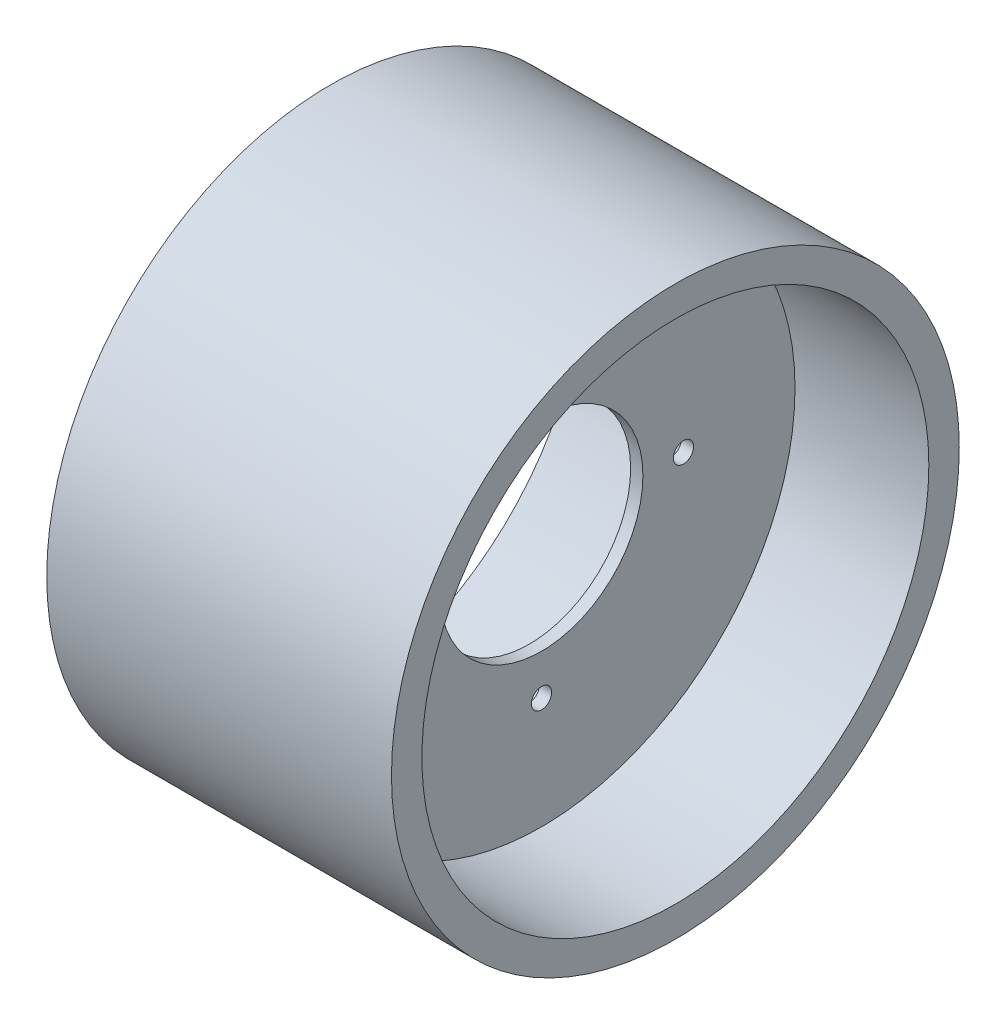
ISO-10303-21;
HEADER;
FILE_DESCRIPTION(('STEP AP214'),'2;1');
FILE_NAME('part.step','',(''),(''),'','','');
FILE_SCHEMA(('AUTOMOTIVE_DESIGN { 1 0 10303 214 1 1 1 1 }'));
ENDSEC;
DATA;
#1=APPLICATION_CONTEXT('core data for automotive mechanical design processes');
#2=APPLICATION_PROTOCOL_DEFINITION('international standard','automotive_design',2000,#1);
#3=PRODUCT_CONTEXT('',#1,'mechanical');
#4=PRODUCT('Part','Part','',(#3));
#5=PRODUCT_RELATED_PRODUCT_CATEGORY('part','',(#4));
#6=PRODUCT_DEFINITION_FORMATION('','',#4);
#7=PRODUCT_DEFINITION_CONTEXT('part definition',#1,'design');
#8=PRODUCT_DEFINITION('design','',#6,#7);
#9=PRODUCT_DEFINITION_SHAPE('','',#8);
#10=(LENGTH_UNIT() NAMED_UNIT(*) SI_UNIT(.MILLI.,.METRE.));
#11=(NAMED_UNIT(*) PLANE_ANGLE_UNIT() SI_UNIT($,.RADIAN.));
#12=(NAMED_UNIT(*) SI_UNIT($,.STERADIAN.) SOLID_ANGLE_UNIT());
#13=UNCERTAINTY_MEASURE_WITH_UNIT(LENGTH_MEASURE(1.E-05),#10,'distance_accuracy_value','');
#14=(GEOMETRIC_REPRESENTATION_CONTEXT(3) GLOBAL_UNCERTAINTY_ASSIGNED_CONTEXT((#13)) GLOBAL_UNIT_ASSIGNED_CONTEXT((#10,
#11,#12)) REPRESENTATION_CONTEXT('',''));
#15=CARTESIAN_POINT('',(0.,0.,0.));
#16=DIRECTION('',(0.,0.,1.));
#17=DIRECTION('',(1.,0.,0.));
#18=AXIS2_PLACEMENT_3D('',#15,#16,#17);
#19=CARTESIAN_POINT('',(-20.4989746825868,-313.45,0.));
#20=DIRECTION('',(-1.,0.,0.));
#21=DIRECTION('',(0.,0.,1.));
#22=AXIS2_PLACEMENT_3D('',#19,#20,#21);
#23=PLANE('',#22);
#24=CARTESIAN_POINT('',(-20.4989746825868,34.8277777777777,0.));
#25=DIRECTION('',(1.,0.,0.));
#26=DIRECTION('',(0.,0.,-1.));
#27=AXIS2_PLACEMENT_3D('',#24,#25,#26);
#28=CIRCLE('',#27,106.370826171699);
#29=CARTESIAN_POINT('',(-20.4989746825868,34.8277777777777,-106.370826171699));
#30=VERTEX_POINT('',#29);
#31=EDGE_CURVE('E10',#30,#30,#28,.T.);
#32=ORIENTED_EDGE('',*,*,#31,.T.);
#33=EDGE_LOOP('',(#32));
#34=FACE_BOUND('',#33,.T.);
#35=CARTESIAN_POINT('',(-20.4989746825868,34.8277777777777,0.));
#36=DIRECTION('',(1.,0.,0.));
#37=DIRECTION('',(0.,0.,-1.));
#38=AXIS2_PLACEMENT_3D('',#35,#36,#37);
#39=CIRCLE('',#38,125.);
#40=CARTESIAN_POINT('',(-20.4989746825868,34.8277777777777,-125.));
#41=VERTEX_POINT('',#40);
#42=EDGE_CURVE('E92',#41,#41,#39,.T.);
#43=ORIENTED_EDGE('',*,*,#42,.F.);
#44=EDGE_LOOP('',(#43));
#45=FACE_BOUND('',#44,.T.);
#46=ADVANCED_FACE('F45',(#34,#45),#23,.T.);
#47=CARTESIAN_POINT('',(60.3370717670074,34.8277777777777,0.));
#48=DIRECTION('',(1.,0.,0.));
#49=DIRECTION('',(0.,0.,-1.));
#50=AXIS2_PLACEMENT_3D('',#47,#48,#49);
#51=CYLINDRICAL_SURFACE('',#50,106.370826171699);
#52=CARTESIAN_POINT('',(-11.7127321786208,34.8277777777777,0.));
#53=DIRECTION('',(1.,0.,0.));
#54=DIRECTION('',(0.,0.,-1.));
#55=AXIS2_PLACEMENT_3D('',#52,#53,#54);
#56=CIRCLE('',#55,106.370826171699);
#57=CARTESIAN_POINT('',(-11.7127321786208,34.8277777777777,-106.370826171699));
#58=VERTEX_POINT('',#57);
#59=EDGE_CURVE('E53',#58,#58,#56,.T.);
#60=ORIENTED_EDGE('',*,*,#59,.T.);
#61=EDGE_LOOP('',(#60));
#62=FACE_BOUND('',#61,.T.);
#63=ORIENTED_EDGE('',*,*,#31,.F.);
#64=EDGE_LOOP('',(#63));
#65=FACE_BOUND('',#64,.T.);
#66=ADVANCED_FACE('F168',(#62,#65),#51,.F.);
#67=CARTESIAN_POINT('',(-11.7127321786208,-313.45,0.));
#68=DIRECTION('',(1.,0.,0.));
#69=DIRECTION('',(0.,0.,-1.));
#70=AXIS2_PLACEMENT_3D('',#67,#68,#69);
#71=PLANE('',#70);
#72=CARTESIAN_POINT('',(-11.7127321786208,34.8277777777777,-70.));
#73=DIRECTION('',(1.,0.,0.));
#74=DIRECTION('',(0.,0.,-1.));
#75=AXIS2_PLACEMENT_3D('',#72,#73,#74);
#76=CIRCLE('',#75,5.00000000000001);
#77=CARTESIAN_POINT('',(-11.7127321786208,34.8277777777777,-75.));
#78=VERTEX_POINT('',#77);
#79=EDGE_CURVE('E88',#78,#78,#76,.F.);
#80=ORIENTED_EDGE('',*,*,#79,.F.);
#81=EDGE_LOOP('',(#80));
#82=FACE_BOUND('',#81,.T.);
#83=CARTESIAN_POINT('',(-11.7127321786208,104.827777777778,0.));
#84=DIRECTION('',(1.,0.,0.));
#85=DIRECTION('',(0.,0.,-1.));
#86=AXIS2_PLACEMENT_3D('',#83,#84,#85);
#87=CIRCLE('',#86,5.00000000000001);
#88=CARTESIAN_POINT('',(-11.7127321786208,104.827777777778,-5.00000000000001));
#89=VERTEX_POINT('',#88);
#90=EDGE_CURVE('E75',#89,#89,#87,.F.);
#91=ORIENTED_EDGE('',*,*,#90,.F.);
#92=EDGE_LOOP('',(#91));
#93=FACE_BOUND('',#92,.T.);
#94=CARTESIAN_POINT('',(-11.7127321786208,34.8277777777777,70.));
#95=DIRECTION('',(1.,0.,0.));
#96=DIRECTION('',(0.,0.,-1.));
#97=AXIS2_PLACEMENT_3D('',#94,#95,#96);
#98=CIRCLE('',#97,5.00000000000001);
#99=CARTESIAN_POINT('',(-11.7127321786208,34.8277777777777,65.));
#100=VERTEX_POINT('',#99);
#101=EDGE_CURVE('E71',#100,#100,#98,.F.);
#102=ORIENTED_EDGE('',*,*,#101,.F.);
#103=EDGE_LOOP('',(#102));
#104=FACE_BOUND('',#103,.T.);
#105=CARTESIAN_POINT('',(-11.7127321786208,-35.1722222222223,0.));
#106=DIRECTION('',(1.,0.,0.));
#107=DIRECTION('',(0.,0.,-1.));
#108=AXIS2_PLACEMENT_3D('',#105,#106,#107);
#109=CIRCLE('',#108,5.);
#110=CARTESIAN_POINT('',(-11.7127321786208,-35.1722222222223,-4.99999999999999));
#111=VERTEX_POINT('',#110);
#112=EDGE_CURVE('E67',#111,#111,#109,.F.);
#113=ORIENTED_EDGE('',*,*,#112,.F.);
#114=EDGE_LOOP('',(#113));
#115=FACE_BOUND('',#114,.T.);
#116=ORIENTED_EDGE('',*,*,#59,.F.);
#117=EDGE_LOOP('',(#116));
#118=FACE_BOUND('',#117,.T.);
#119=CARTESIAN_POINT('',(-11.7127321786208,34.8277777777777,0.));
#120=DIRECTION('',(1.,0.,0.));
#121=DIRECTION('',(0.,0.,-1.));
#122=AXIS2_PLACEMENT_3D('',#119,#120,#121);
#123=CIRCLE('',#122,50.);
#124=CARTESIAN_POINT('',(-11.7127321786208,34.8277777777777,-50.));
#125=VERTEX_POINT('',#124);
#126=EDGE_CURVE('E59',#125,#125,#123,.T.);
#127=ORIENTED_EDGE('',*,*,#126,.T.);
#128=EDGE_LOOP('',(#127));
#129=FACE_BOUND('',#128,.T.);
#130=ADVANCED_FACE('F123',(#82,#93,#104,#115,#118,#129),#71,.F.);
#131=CARTESIAN_POINT('',(60.3370717670074,34.8277777777777,0.));
#132=DIRECTION('',(1.,0.,0.));
#133=DIRECTION('',(0.,0.,-1.));
#134=AXIS2_PLACEMENT_3D('',#131,#132,#133);
#135=CYLINDRICAL_SURFACE('',#134,50.);
#136=ORIENTED_EDGE('',*,*,#126,.F.);
#137=EDGE_LOOP('',(#136));
#138=FACE_BOUND('',#137,.T.);
#139=CARTESIAN_POINT('',(-5.66292823299262,34.8277777777777,0.));
#140=DIRECTION('',(1.,0.,0.));
#141=DIRECTION('',(0.,0.,-1.));
#142=AXIS2_PLACEMENT_3D('',#139,#140,#141);
#143=CIRCLE('',#142,50.);
#144=CARTESIAN_POINT('',(-5.66292823299262,34.8277777777777,-50.));
#145=VERTEX_POINT('',#144);
#146=EDGE_CURVE('E116',#145,#145,#143,.T.);
#147=ORIENTED_EDGE('',*,*,#146,.T.);
#148=EDGE_LOOP('',(#147));
#149=FACE_BOUND('',#148,.T.);
#150=ADVANCED_FACE('F125',(#138,#149),#135,.F.);
#151=CARTESIAN_POINT('',(-5.66292823299258,-313.45,0.));
#152=DIRECTION('',(-1.,0.,0.));
#153=DIRECTION('',(0.,0.,1.));
#154=AXIS2_PLACEMENT_3D('',#151,#152,#153);
#155=PLANE('',#154);
#156=CARTESIAN_POINT('',(-5.66292823299258,34.8277777777777,-70.));
#157=DIRECTION('',(-1.,0.,0.));
#158=DIRECTION('',(0.,0.,1.));
#159=AXIS2_PLACEMENT_3D('',#156,#157,#158);
#160=CIRCLE('',#159,5.00000000000001);
#161=CARTESIAN_POINT('',(-5.66292823299258,34.8277777777777,-65.));
#162=VERTEX_POINT('',#161);
#163=EDGE_CURVE('E48',#162,#162,#160,.F.);
#164=ORIENTED_EDGE('',*,*,#163,.F.);
#165=EDGE_LOOP('',(#164));
#166=FACE_BOUND('',#165,.T.);
#167=CARTESIAN_POINT('',(-5.66292823299258,104.827777777778,0.));
#168=DIRECTION('',(-1.,0.,0.));
#169=DIRECTION('',(0.,0.,1.));
#170=AXIS2_PLACEMENT_3D('',#167,#168,#169);
#171=CIRCLE('',#170,5.00000000000001);
#172=CARTESIAN_POINT('',(-5.66292823299258,104.827777777778,5.00000000000001));
#173=VERTEX_POINT('',#172);
#174=EDGE_CURVE('E72',#173,#173,#171,.F.);
#175=ORIENTED_EDGE('',*,*,#174,.F.);
#176=EDGE_LOOP('',(#175));
#177=FACE_BOUND('',#176,.T.);
#178=CARTESIAN_POINT('',(-5.66292823299258,34.8277777777777,70.));
#179=DIRECTION('',(-1.,0.,0.));
#180=DIRECTION('',(0.,0.,1.));
#181=AXIS2_PLACEMENT_3D('',#178,#179,#180);
#182=CIRCLE('',#181,5.00000000000001);
#183=CARTESIAN_POINT('',(-5.66292823299258,34.8277777777777,75.));
#184=VERTEX_POINT('',#183);
#185=EDGE_CURVE('E68',#184,#184,#182,.F.);
#186=ORIENTED_EDGE('',*,*,#185,.F.);
#187=EDGE_LOOP('',(#186));
#188=FACE_BOUND('',#187,.T.);
#189=CARTESIAN_POINT('',(-5.66292823299258,-35.1722222222223,0.));
#190=DIRECTION('',(-1.,0.,0.));
#191=DIRECTION('',(0.,0.,1.));
#192=AXIS2_PLACEMENT_3D('',#189,#190,#191);
#193=CIRCLE('',#192,5.);
#194=CARTESIAN_POINT('',(-5.66292823299258,-35.1722222222223,5.00000000000001));
#195=VERTEX_POINT('',#194);
#196=EDGE_CURVE('E63',#195,#195,#193,.F.);
#197=ORIENTED_EDGE('',*,*,#196,.F.);
#198=EDGE_LOOP('',(#197));
#199=FACE_BOUND('',#198,.T.);
#200=ORIENTED_EDGE('',*,*,#146,.F.);
#201=EDGE_LOOP('',(#200));
#202=FACE_BOUND('',#201,.T.);
#203=CARTESIAN_POINT('',(-5.66292823299258,34.8277777777777,0.));
#204=DIRECTION('',(1.,0.,0.));
#205=DIRECTION('',(0.,0.,-1.));
#206=AXIS2_PLACEMENT_3D('',#203,#204,#205);
#207=CIRCLE('',#206,125.);
#208=CARTESIAN_POINT('',(-5.66292823299258,34.8277777777777,-125.));
#209=VERTEX_POINT('',#208);
#210=EDGE_CURVE('E112',#209,#209,#207,.T.);
#211=ORIENTED_EDGE('',*,*,#210,.T.);
#212=EDGE_LOOP('',(#211));
#213=FACE_BOUND('',#212,.T.);
#214=ADVANCED_FACE('F128',(#166,#177,#188,#199,#202,#213),#155,.F.);
#215=CARTESIAN_POINT('',(60.3370717670074,34.8277777777777,0.));
#216=DIRECTION('',(1.,0.,0.));
#217=DIRECTION('',(0.,0.,-1.));
#218=AXIS2_PLACEMENT_3D('',#215,#216,#217);
#219=CYLINDRICAL_SURFACE('',#218,125.);
#220=ORIENTED_EDGE('',*,*,#210,.F.);
#221=EDGE_LOOP('',(#220));
#222=FACE_BOUND('',#221,.T.);
#223=CARTESIAN_POINT('',(60.3370717670074,34.8277777777777,0.));
#224=DIRECTION('',(1.,0.,0.));
#225=DIRECTION('',(0.,0.,-1.));
#226=AXIS2_PLACEMENT_3D('',#223,#224,#225);
#227=CIRCLE('',#226,125.);
#228=CARTESIAN_POINT('',(60.3370717670074,34.8277777777777,-125.));
#229=VERTEX_POINT('',#228);
#230=EDGE_CURVE('E108',#229,#229,#227,.T.);
#231=ORIENTED_EDGE('',*,*,#230,.T.);
#232=EDGE_LOOP('',(#231));
#233=FACE_BOUND('',#232,.T.);
#234=ADVANCED_FACE('F134',(#222,#233),#219,.F.);
#235=CARTESIAN_POINT('',(60.3370717670074,-313.45,0.));
#236=DIRECTION('',(-1.,0.,0.));
#237=DIRECTION('',(0.,0.,1.));
#238=AXIS2_PLACEMENT_3D('',#235,#236,#237);
#239=PLANE('',#238);
#240=ORIENTED_EDGE('',*,*,#230,.F.);
#241=EDGE_LOOP('',(#240));
#242=FACE_BOUND('',#241,.T.);
#243=CARTESIAN_POINT('',(60.3370717670074,34.8277777777777,0.));
#244=DIRECTION('',(1.,0.,0.));
#245=DIRECTION('',(0.,0.,-1.));
#246=AXIS2_PLACEMENT_3D('',#243,#244,#245);
#247=CIRCLE('',#246,140.);
#248=CARTESIAN_POINT('',(60.3370717670074,34.8277777777777,-140.));
#249=VERTEX_POINT('',#248);
#250=EDGE_CURVE('E104',#249,#249,#247,.T.);
#251=ORIENTED_EDGE('',*,*,#250,.T.);
#252=EDGE_LOOP('',(#251));
#253=FACE_BOUND('',#252,.T.);
#254=ADVANCED_FACE('F141',(#242,#253),#239,.F.);
#255=CARTESIAN_POINT('',(60.3370717670074,34.8277777777777,0.));
#256=DIRECTION('',(1.,0.,0.));
#257=DIRECTION('',(0.,0.,-1.));
#258=AXIS2_PLACEMENT_3D('',#255,#256,#257);
#259=CYLINDRICAL_SURFACE('',#258,140.);
#260=ORIENTED_EDGE('',*,*,#250,.F.);
#261=EDGE_LOOP('',(#260));
#262=FACE_BOUND('',#261,.T.);
#263=CARTESIAN_POINT('',(-109.662928232993,34.8277777777777,0.));
#264=DIRECTION('',(1.,0.,0.));
#265=DIRECTION('',(0.,0.,-1.));
#266=AXIS2_PLACEMENT_3D('',#263,#264,#265);
#267=CIRCLE('',#266,140.);
#268=CARTESIAN_POINT('',(-109.662928232993,34.8277777777777,-140.));
#269=VERTEX_POINT('',#268);
#270=EDGE_CURVE('E100',#269,#269,#267,.T.);
#271=ORIENTED_EDGE('',*,*,#270,.T.);
#272=EDGE_LOOP('',(#271));
#273=FACE_BOUND('',#272,.T.);
#274=ADVANCED_FACE('F147',(#262,#273),#259,.T.);
#275=CARTESIAN_POINT('',(-109.662928232993,-313.45,0.));
#276=DIRECTION('',(-1.,0.,0.));
#277=DIRECTION('',(0.,0.,1.));
#278=AXIS2_PLACEMENT_3D('',#275,#276,#277);
#279=PLANE('',#278);
#280=CARTESIAN_POINT('',(-109.662928232993,34.8277777777777,0.));
#281=DIRECTION('',(1.,0.,0.));
#282=DIRECTION('',(0.,0.,-1.));
#283=AXIS2_PLACEMENT_3D('',#280,#281,#282);
#284=CIRCLE('',#283,125.);
#285=CARTESIAN_POINT('',(-109.662928232993,34.8277777777777,-125.));
#286=VERTEX_POINT('',#285);
#287=EDGE_CURVE('E96',#286,#286,#284,.T.);
#288=ORIENTED_EDGE('',*,*,#287,.T.);
#289=EDGE_LOOP('',(#288));
#290=FACE_BOUND('',#289,.T.);
#291=ORIENTED_EDGE('',*,*,#270,.F.);
#292=EDGE_LOOP('',(#291));
#293=FACE_BOUND('',#292,.T.);
#294=ADVANCED_FACE('F153',(#290,#293),#279,.T.);
#295=CARTESIAN_POINT('',(60.3370717670074,34.8277777777777,0.));
#296=DIRECTION('',(1.,0.,0.));
#297=DIRECTION('',(0.,0.,-1.));
#298=AXIS2_PLACEMENT_3D('',#295,#296,#297);
#299=CYLINDRICAL_SURFACE('',#298,125.);
#300=ORIENTED_EDGE('',*,*,#42,.T.);
#301=EDGE_LOOP('',(#300));
#302=FACE_BOUND('',#301,.T.);
#303=ORIENTED_EDGE('',*,*,#287,.F.);
#304=EDGE_LOOP('',(#303));
#305=FACE_BOUND('',#304,.T.);
#306=ADVANCED_FACE('F158',(#302,#305),#299,.F.);
#307=CARTESIAN_POINT('',(-21.7127321786208,-35.1722222222223,0.));
#308=DIRECTION('',(1.,0.,0.));
#309=DIRECTION('',(0.,0.,-1.));
#310=AXIS2_PLACEMENT_3D('',#307,#308,#309);
#311=CYLINDRICAL_SURFACE('',#310,5.);
#312=ORIENTED_EDGE('',*,*,#196,.T.);
#313=EDGE_LOOP('',(#312));
#314=FACE_BOUND('',#313,.T.);
#315=ORIENTED_EDGE('',*,*,#112,.T.);
#316=EDGE_LOOP('',(#315));
#317=FACE_BOUND('',#316,.T.);
#318=ADVANCED_FACE('F164',(#314,#317),#311,.F.);
#319=CARTESIAN_POINT('',(-21.7127321786208,34.8277777777777,70.));
#320=DIRECTION('',(1.,0.,0.));
#321=DIRECTION('',(0.,0.,-1.));
#322=AXIS2_PLACEMENT_3D('',#319,#320,#321);
#323=CYLINDRICAL_SURFACE('',#322,5.00000000000001);
#324=ORIENTED_EDGE('',*,*,#185,.T.);
#325=EDGE_LOOP('',(#324));
#326=FACE_BOUND('',#325,.T.);
#327=ORIENTED_EDGE('',*,*,#101,.T.);
#328=EDGE_LOOP('',(#327));
#329=FACE_BOUND('',#328,.T.);
#330=ADVANCED_FACE('F197',(#326,#329),#323,.F.);
#331=CARTESIAN_POINT('',(-21.7127321786208,104.827777777778,0.));
#332=DIRECTION('',(1.,0.,0.));
#333=DIRECTION('',(0.,0.,-1.));
#334=AXIS2_PLACEMENT_3D('',#331,#332,#333);
#335=CYLINDRICAL_SURFACE('',#334,5.00000000000001);
#336=ORIENTED_EDGE('',*,*,#174,.T.);
#337=EDGE_LOOP('',(#336));
#338=FACE_BOUND('',#337,.T.);
#339=ORIENTED_EDGE('',*,*,#90,.T.);
#340=EDGE_LOOP('',(#339));
#341=FACE_BOUND('',#340,.T.);
#342=ADVANCED_FACE('F203',(#338,#341),#335,.F.);
#343=CARTESIAN_POINT('',(-21.7127321786208,34.8277777777777,-70.));
#344=DIRECTION('',(1.,0.,0.));
#345=DIRECTION('',(0.,0.,-1.));
#346=AXIS2_PLACEMENT_3D('',#343,#344,#345);
#347=CYLINDRICAL_SURFACE('',#346,5.00000000000001);
#348=ORIENTED_EDGE('',*,*,#163,.T.);
#349=EDGE_LOOP('',(#348));
#350=FACE_BOUND('',#349,.T.);
#351=ORIENTED_EDGE('',*,*,#79,.T.);
#352=EDGE_LOOP('',(#351));
#353=FACE_BOUND('',#352,.T.);
#354=ADVANCED_FACE('F209',(#350,#353),#347,.F.);
#355=CLOSED_SHELL('',(#46,#66,#130,#150,#214,#234,#254,#274,#294,#306,#318,#330,#342,#354));
#356=MANIFOLD_SOLID_BREP('B2',#355);
#357=ADVANCED_BREP_SHAPE_REPRESENTATION('',(#18,#356),#14);
#358=SHAPE_DEFINITION_REPRESENTATION(#9,#357);
ENDSEC;
END-ISO-10303-21;
